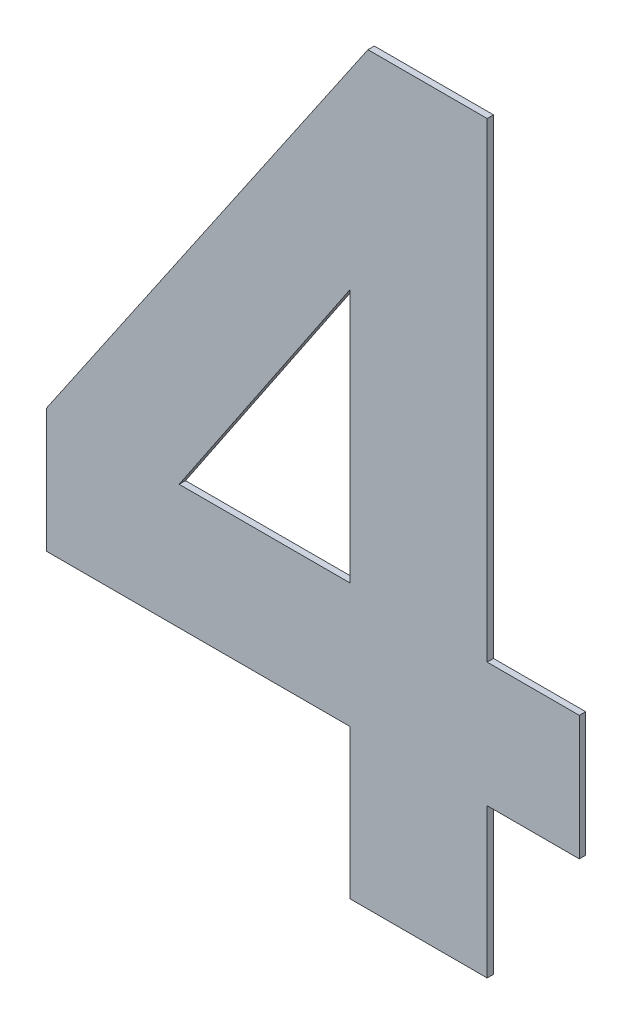
ISO-10303-21;
HEADER;
FILE_DESCRIPTION(('STEP AP214'),'2;1');
FILE_NAME('part.step','',(''),(''),'','','');
FILE_SCHEMA(('AUTOMOTIVE_DESIGN { 1 0 10303 214 1 1 1 1 }'));
ENDSEC;
DATA;
#1=APPLICATION_CONTEXT('core data for automotive mechanical design processes');
#2=APPLICATION_PROTOCOL_DEFINITION('international standard','automotive_design',2000,#1);
#3=PRODUCT_CONTEXT('',#1,'mechanical');
#4=PRODUCT('Part','Part','',(#3));
#5=PRODUCT_RELATED_PRODUCT_CATEGORY('part','',(#4));
#6=PRODUCT_DEFINITION_FORMATION('','',#4);
#7=PRODUCT_DEFINITION_CONTEXT('part definition',#1,'design');
#8=PRODUCT_DEFINITION('design','',#6,#7);
#9=PRODUCT_DEFINITION_SHAPE('','',#8);
#10=(LENGTH_UNIT() NAMED_UNIT(*) SI_UNIT(.MILLI.,.METRE.));
#11=(NAMED_UNIT(*) PLANE_ANGLE_UNIT() SI_UNIT($,.RADIAN.));
#12=(NAMED_UNIT(*) SI_UNIT($,.STERADIAN.) SOLID_ANGLE_UNIT());
#13=UNCERTAINTY_MEASURE_WITH_UNIT(LENGTH_MEASURE(1.E-05),#10,'distance_accuracy_value','');
#14=(GEOMETRIC_REPRESENTATION_CONTEXT(3) GLOBAL_UNCERTAINTY_ASSIGNED_CONTEXT((#13)) GLOBAL_UNIT_ASSIGNED_CONTEXT((#10,
#11,#12)) REPRESENTATION_CONTEXT('',''));
#15=CARTESIAN_POINT('',(0.,0.,0.));
#16=DIRECTION('',(0.,0.,1.));
#17=DIRECTION('',(1.,0.,0.));
#18=AXIS2_PLACEMENT_3D('',#15,#16,#17);
#19=CARTESIAN_POINT('',(-0.0714182155333893,-0.0342638281652913,0.));
#20=DIRECTION('',(0.,-1.,0.));
#21=DIRECTION('',(1.,0.,0.));
#22=AXIS2_PLACEMENT_3D('',#19,#20,#21);
#23=PLANE('',#22);
#24=DIRECTION('',(1.,0.,0.));
#25=VECTOR('',#24,1.);
#26=CARTESIAN_POINT('',(-0.0310230602288788,-0.0342638281652913,0.));
#27=LINE('',#26,#25);
#28=CARTESIAN_POINT('',(-0.0714182155333893,-0.0342638281652913,0.));
#29=VERTEX_POINT('',#28);
#30=CARTESIAN_POINT('',(0.00914580919985388,-0.0342638281652913,0.));
#31=VERTEX_POINT('',#30);
#32=EDGE_CURVE('E11',#29,#31,#27,.T.);
#33=ORIENTED_EDGE('',*,*,#32,.F.);
#34=DIRECTION('',(0.,0.,1.));
#35=VECTOR('',#34,1.);
#36=CARTESIAN_POINT('',(-0.0714182155333893,-0.0342638281652913,0.));
#37=LINE('',#36,#35);
#38=CARTESIAN_POINT('',(-0.0714182155333893,-0.0342638281652913,0.003));
#39=VERTEX_POINT('',#38);
#40=EDGE_CURVE('E24',#29,#39,#37,.T.);
#41=ORIENTED_EDGE('',*,*,#40,.T.);
#42=DIRECTION('',(-1.,0.,0.));
#43=VECTOR('',#42,1.);
#44=CARTESIAN_POINT('',(-0.0310230602288788,-0.0342638281652913,0.003));
#45=LINE('',#44,#43);
#46=CARTESIAN_POINT('',(0.00914580919985388,-0.0342638281652913,0.003));
#47=VERTEX_POINT('',#46);
#48=EDGE_CURVE('E228',#47,#39,#45,.T.);
#49=ORIENTED_EDGE('',*,*,#48,.F.);
#50=DIRECTION('',(0.,0.,1.));
#51=VECTOR('',#50,1.);
#52=CARTESIAN_POINT('',(0.00914580919985388,-0.0342638281652913,0.));
#53=LINE('',#52,#51);
#54=EDGE_CURVE('E225',#31,#47,#53,.T.);
#55=ORIENTED_EDGE('',*,*,#54,.F.);
#56=EDGE_LOOP('',(#33,#41,#49,#55));
#57=FACE_BOUND('',#56,.T.);
#58=ADVANCED_FACE('F17',(#57),#23,.F.);
#59=CARTESIAN_POINT('',(0.00914580919985388,0.0855151357592987,0.));
#60=DIRECTION('',(-0.829768791902232,0.558107294330678,0.));
#61=DIRECTION('',(-0.558107294330678,-0.829768791902232,0.));
#62=AXIS2_PLACEMENT_3D('',#59,#60,#61);
#63=PLANE('',#62);
#64=DIRECTION('',(-0.558107294330678,-0.829768791902233,0.));
#65=VECTOR('',#64,1.);
#66=CARTESIAN_POINT('',(-0.0120148419785438,0.0540544325172438,0.));
#67=LINE('',#66,#65);
#68=CARTESIAN_POINT('',(0.00914580919985388,0.0855151357592987,0.));
#69=VERTEX_POINT('',#68);
#70=EDGE_CURVE('E223',#69,#29,#67,.T.);
#71=ORIENTED_EDGE('',*,*,#70,.F.);
#72=DIRECTION('',(0.,0.,1.));
#73=VECTOR('',#72,1.);
#74=CARTESIAN_POINT('',(0.00914580919985388,0.0855151357592987,0.));
#75=LINE('',#74,#73);
#76=CARTESIAN_POINT('',(0.00914580919985388,0.0855151357592987,0.003));
#77=VERTEX_POINT('',#76);
#78=EDGE_CURVE('E221',#69,#77,#75,.T.);
#79=ORIENTED_EDGE('',*,*,#78,.T.);
#80=DIRECTION('',(0.558107294330678,0.829768791902233,0.));
#81=VECTOR('',#80,1.);
#82=CARTESIAN_POINT('',(-0.0120148419785438,0.0540544325172438,0.003));
#83=LINE('',#82,#81);
#84=EDGE_CURVE('E218',#39,#77,#83,.T.);
#85=ORIENTED_EDGE('',*,*,#84,.F.);
#86=ORIENTED_EDGE('',*,*,#40,.F.);
#87=EDGE_LOOP('',(#71,#79,#85,#86));
#88=FACE_BOUND('',#87,.T.);
#89=ADVANCED_FACE('F233',(#88),#63,.F.);
#90=CARTESIAN_POINT('',(0.00914580919985388,-0.0342638281652913,0.));
#91=DIRECTION('',(1.,0.,0.));
#92=DIRECTION('',(0.,1.,0.));
#93=AXIS2_PLACEMENT_3D('',#90,#91,#92);
#94=PLANE('',#93);
#95=DIRECTION('',(0.,1.,0.));
#96=VECTOR('',#95,1.);
#97=CARTESIAN_POINT('',(0.00914580919985388,-0.0201439265566738,0.));
#98=LINE('',#97,#96);
#99=EDGE_CURVE('E216',#31,#69,#98,.T.);
#100=ORIENTED_EDGE('',*,*,#99,.F.);
#101=ORIENTED_EDGE('',*,*,#54,.T.);
#102=DIRECTION('',(0.,-1.,0.));
#103=VECTOR('',#102,1.);
#104=CARTESIAN_POINT('',(0.00914580919985388,-0.0201439265566738,0.003));
#105=LINE('',#104,#103);
#106=EDGE_CURVE('E213',#77,#47,#105,.T.);
#107=ORIENTED_EDGE('',*,*,#106,.F.);
#108=ORIENTED_EDGE('',*,*,#78,.F.);
#109=EDGE_LOOP('',(#100,#101,#107,#108));
#110=FACE_BOUND('',#109,.T.);
#111=ADVANCED_FACE('F237',(#110),#94,.F.);
#112=CARTESIAN_POINT('',(-0.134108764580781,-0.0929528528054023,0.));
#113=DIRECTION('',(0.,-1.,0.));
#114=DIRECTION('',(1.,0.,0.));
#115=AXIS2_PLACEMENT_3D('',#112,#113,#114);
#116=PLANE('',#115);
#117=DIRECTION('',(-1.,0.,0.));
#118=VECTOR('',#117,1.);
#119=CARTESIAN_POINT('',(0.00914580919985388,-0.0929528528054023,0.));
#120=LINE('',#119,#118);
#121=CARTESIAN_POINT('',(0.00914580919985388,-0.0929528528054023,0.));
#122=VERTEX_POINT('',#121);
#123=CARTESIAN_POINT('',(-0.134108764580781,-0.0929528528054023,0.));
#124=VERTEX_POINT('',#123);
#125=EDGE_CURVE('E211',#122,#124,#120,.T.);
#126=ORIENTED_EDGE('',*,*,#125,.F.);
#127=DIRECTION('',(0.,0.,1.));
#128=VECTOR('',#127,1.);
#129=CARTESIAN_POINT('',(0.00914580919985388,-0.0929528528054023,0.));
#130=LINE('',#129,#128);
#131=CARTESIAN_POINT('',(0.00914580919985388,-0.0929528528054023,0.003));
#132=VERTEX_POINT('',#131);
#133=EDGE_CURVE('E209',#122,#132,#130,.T.);
#134=ORIENTED_EDGE('',*,*,#133,.T.);
#135=DIRECTION('',(1.,0.,0.));
#136=VECTOR('',#135,1.);
#137=CARTESIAN_POINT('',(0.00914580919985388,-0.0929528528054023,0.003));
#138=LINE('',#137,#136);
#139=CARTESIAN_POINT('',(-0.134108764580781,-0.0929528528054023,0.003));
#140=VERTEX_POINT('',#139);
#141=EDGE_CURVE('E140',#140,#132,#138,.T.);
#142=ORIENTED_EDGE('',*,*,#141,.F.);
#143=DIRECTION('',(0.,0.,1.));
#144=VECTOR('',#143,1.);
#145=CARTESIAN_POINT('',(-0.134108764580781,-0.0929528528054023,0.));
#146=LINE('',#145,#144);
#147=EDGE_CURVE('E205',#124,#140,#146,.T.);
#148=ORIENTED_EDGE('',*,*,#147,.F.);
#149=EDGE_LOOP('',(#126,#134,#142,#148));
#150=FACE_BOUND('',#149,.T.);
#151=ADVANCED_FACE('F256',(#150),#116,.T.);
#152=CARTESIAN_POINT('',(-0.134108764580781,-0.03453059645911,0.));
#153=DIRECTION('',(-1.,0.,0.));
#154=DIRECTION('',(0.,-1.,0.));
#155=AXIS2_PLACEMENT_3D('',#152,#153,#154);
#156=PLANE('',#155);
#157=DIRECTION('',(0.,1.,0.));
#158=VECTOR('',#157,1.);
#159=CARTESIAN_POINT('',(-0.134108764580781,-0.0929528528054023,0.));
#160=LINE('',#159,#158);
#161=CARTESIAN_POINT('',(-0.134108764580781,-0.03453059645911,0.));
#162=VERTEX_POINT('',#161);
#163=EDGE_CURVE('E203',#124,#162,#160,.T.);
#164=ORIENTED_EDGE('',*,*,#163,.F.);
#165=ORIENTED_EDGE('',*,*,#147,.T.);
#166=DIRECTION('',(0.,-1.,0.));
#167=VECTOR('',#166,1.);
#168=CARTESIAN_POINT('',(-0.134108764580781,-0.0929528528054023,0.003));
#169=LINE('',#168,#167);
#170=CARTESIAN_POINT('',(-0.134108764580781,-0.03453059645911,0.003));
#171=VERTEX_POINT('',#170);
#172=EDGE_CURVE('E201',#171,#140,#169,.T.);
#173=ORIENTED_EDGE('',*,*,#172,.F.);
#174=DIRECTION('',(0.,0.,1.));
#175=VECTOR('',#174,1.);
#176=CARTESIAN_POINT('',(-0.134108764580781,-0.03453059645911,0.));
#177=LINE('',#176,#175);
#178=EDGE_CURVE('E198',#162,#171,#177,.T.);
#179=ORIENTED_EDGE('',*,*,#178,.F.);
#180=EDGE_LOOP('',(#164,#165,#173,#179));
#181=FACE_BOUND('',#180,.T.);
#182=ADVANCED_FACE('F261',(#181),#156,.T.);
#183=CARTESIAN_POINT('',(0.0176823946020518,0.187954160585674,0.));
#184=DIRECTION('',(-0.826059665171431,0.563582673240461,0.));
#185=DIRECTION('',(-0.563582673240461,-0.826059665171431,0.));
#186=AXIS2_PLACEMENT_3D('',#183,#184,#185);
#187=PLANE('',#186);
#188=DIRECTION('',(0.56358267324046,0.826059665171431,0.));
#189=VECTOR('',#188,1.);
#190=CARTESIAN_POINT('',(-0.134108764580781,-0.03453059645911,0.));
#191=LINE('',#190,#189);
#192=CARTESIAN_POINT('',(0.0176823946020518,0.187954160585674,0.));
#193=VERTEX_POINT('',#192);
#194=EDGE_CURVE('E196',#162,#193,#191,.T.);
#195=ORIENTED_EDGE('',*,*,#194,.F.);
#196=ORIENTED_EDGE('',*,*,#178,.T.);
#197=DIRECTION('',(-0.56358267324046,-0.826059665171431,0.));
#198=VECTOR('',#197,1.);
#199=CARTESIAN_POINT('',(-0.134108764580781,-0.03453059645911,0.003));
#200=LINE('',#199,#198);
#201=CARTESIAN_POINT('',(0.0176823946020518,0.187954160585674,0.003));
#202=VERTEX_POINT('',#201);
#203=EDGE_CURVE('E193',#202,#171,#200,.T.);
#204=ORIENTED_EDGE('',*,*,#203,.F.);
#205=DIRECTION('',(0.,0.,1.));
#206=VECTOR('',#205,1.);
#207=CARTESIAN_POINT('',(0.0176823946020518,0.187954160585674,0.));
#208=LINE('',#207,#206);
#209=EDGE_CURVE('E190',#193,#202,#208,.T.);
#210=ORIENTED_EDGE('',*,*,#209,.F.);
#211=EDGE_LOOP('',(#195,#196,#204,#210));
#212=FACE_BOUND('',#211,.T.);
#213=ADVANCED_FACE('F265',(#212),#187,.T.);
#214=CARTESIAN_POINT('',(0.0739705045977946,0.187954160585674,0.));
#215=DIRECTION('',(0.,1.,0.));
#216=DIRECTION('',(-1.,0.,0.));
#217=AXIS2_PLACEMENT_3D('',#214,#215,#216);
#218=PLANE('',#217);
#219=DIRECTION('',(1.,0.,0.));
#220=VECTOR('',#219,1.);
#221=CARTESIAN_POINT('',(0.0176823946020518,0.187954160585674,0.));
#222=LINE('',#221,#220);
#223=CARTESIAN_POINT('',(0.0739705045977946,0.187954160585674,0.));
#224=VERTEX_POINT('',#223);
#225=EDGE_CURVE('E188',#193,#224,#222,.T.);
#226=ORIENTED_EDGE('',*,*,#225,.F.);
#227=ORIENTED_EDGE('',*,*,#209,.T.);
#228=DIRECTION('',(-1.,0.,0.));
#229=VECTOR('',#228,1.);
#230=CARTESIAN_POINT('',(0.0176823946020518,0.187954160585674,0.003));
#231=LINE('',#230,#229);
#232=CARTESIAN_POINT('',(0.0739705045977946,0.187954160585674,0.003));
#233=VERTEX_POINT('',#232);
#234=EDGE_CURVE('E185',#233,#202,#231,.T.);
#235=ORIENTED_EDGE('',*,*,#234,.F.);
#236=DIRECTION('',(0.,0.,1.));
#237=VECTOR('',#236,1.);
#238=CARTESIAN_POINT('',(0.0739705045977946,0.187954160585674,0.));
#239=LINE('',#238,#237);
#240=EDGE_CURVE('E182',#224,#233,#239,.T.);
#241=ORIENTED_EDGE('',*,*,#240,.F.);
#242=EDGE_LOOP('',(#226,#227,#235,#241));
#243=FACE_BOUND('',#242,.T.);
#244=ADVANCED_FACE('F269',(#243),#218,.T.);
#245=CARTESIAN_POINT('',(0.0739705045977946,-0.0342638281652913,0.));
#246=DIRECTION('',(1.,0.,0.));
#247=DIRECTION('',(0.,1.,0.));
#248=AXIS2_PLACEMENT_3D('',#245,#246,#247);
#249=PLANE('',#248);
#250=DIRECTION('',(0.,-1.,0.));
#251=VECTOR('',#250,1.);
#252=CARTESIAN_POINT('',(0.0739705045977946,0.187954160585674,0.));
#253=LINE('',#252,#251);
#254=CARTESIAN_POINT('',(0.0739705045977946,-0.0342638281652913,0.));
#255=VERTEX_POINT('',#254);
#256=EDGE_CURVE('E180',#224,#255,#253,.T.);
#257=ORIENTED_EDGE('',*,*,#256,.F.);
#258=ORIENTED_EDGE('',*,*,#240,.T.);
#259=DIRECTION('',(0.,1.,0.));
#260=VECTOR('',#259,1.);
#261=CARTESIAN_POINT('',(0.0739705045977946,0.187954160585674,0.003));
#262=LINE('',#261,#260);
#263=CARTESIAN_POINT('',(0.0739705045977946,-0.0342638281652913,0.003));
#264=VERTEX_POINT('',#263);
#265=EDGE_CURVE('E177',#264,#233,#262,.T.);
#266=ORIENTED_EDGE('',*,*,#265,.F.);
#267=DIRECTION('',(0.,0.,1.));
#268=VECTOR('',#267,1.);
#269=CARTESIAN_POINT('',(0.0739705045977946,-0.0342638281652913,0.));
#270=LINE('',#269,#268);
#271=EDGE_CURVE('E174',#255,#264,#270,.T.);
#272=ORIENTED_EDGE('',*,*,#271,.F.);
#273=EDGE_LOOP('',(#257,#258,#266,#272));
#274=FACE_BOUND('',#273,.T.);
#275=ADVANCED_FACE('F273',(#274),#249,.T.);
#276=CARTESIAN_POINT('',(0.11745373649024,-0.0342638281652913,0.));
#277=DIRECTION('',(0.,1.,0.));
#278=DIRECTION('',(-1.,0.,0.));
#279=AXIS2_PLACEMENT_3D('',#276,#277,#278);
#280=PLANE('',#279);
#281=DIRECTION('',(1.,0.,0.));
#282=VECTOR('',#281,1.);
#283=CARTESIAN_POINT('',(0.0739705045977946,-0.0342638281652913,0.));
#284=LINE('',#283,#282);
#285=CARTESIAN_POINT('',(0.11745373649024,-0.0342638281652913,0.));
#286=VERTEX_POINT('',#285);
#287=EDGE_CURVE('E172',#255,#286,#284,.T.);
#288=ORIENTED_EDGE('',*,*,#287,.F.);
#289=ORIENTED_EDGE('',*,*,#271,.T.);
#290=DIRECTION('',(-1.,0.,0.));
#291=VECTOR('',#290,1.);
#292=CARTESIAN_POINT('',(0.0739705045977946,-0.0342638281652913,0.003));
#293=LINE('',#292,#291);
#294=CARTESIAN_POINT('',(0.11745373649024,-0.0342638281652913,0.003));
#295=VERTEX_POINT('',#294);
#296=EDGE_CURVE('E169',#295,#264,#293,.T.);
#297=ORIENTED_EDGE('',*,*,#296,.F.);
#298=DIRECTION('',(0.,0.,1.));
#299=VECTOR('',#298,1.);
#300=CARTESIAN_POINT('',(0.11745373649024,-0.0342638281652913,0.));
#301=LINE('',#300,#299);
#302=EDGE_CURVE('E166',#286,#295,#301,.T.);
#303=ORIENTED_EDGE('',*,*,#302,.F.);
#304=EDGE_LOOP('',(#288,#289,#297,#303));
#305=FACE_BOUND('',#304,.T.);
#306=ADVANCED_FACE('F277',(#305),#280,.T.);
#307=CARTESIAN_POINT('',(0.11745373649024,-0.0929528528054023,0.));
#308=DIRECTION('',(1.,0.,0.));
#309=DIRECTION('',(0.,1.,0.));
#310=AXIS2_PLACEMENT_3D('',#307,#308,#309);
#311=PLANE('',#310);
#312=DIRECTION('',(0.,-1.,0.));
#313=VECTOR('',#312,1.);
#314=CARTESIAN_POINT('',(0.11745373649024,-0.0342638281652913,0.));
#315=LINE('',#314,#313);
#316=CARTESIAN_POINT('',(0.11745373649024,-0.0929528528054023,0.));
#317=VERTEX_POINT('',#316);
#318=EDGE_CURVE('E164',#286,#317,#315,.T.);
#319=ORIENTED_EDGE('',*,*,#318,.F.);
#320=ORIENTED_EDGE('',*,*,#302,.T.);
#321=DIRECTION('',(0.,1.,0.));
#322=VECTOR('',#321,1.);
#323=CARTESIAN_POINT('',(0.11745373649024,-0.0342638281652913,0.003));
#324=LINE('',#323,#322);
#325=CARTESIAN_POINT('',(0.11745373649024,-0.0929528528054023,0.003));
#326=VERTEX_POINT('',#325);
#327=EDGE_CURVE('E161',#326,#295,#324,.T.);
#328=ORIENTED_EDGE('',*,*,#327,.F.);
#329=DIRECTION('',(0.,0.,1.));
#330=VECTOR('',#329,1.);
#331=CARTESIAN_POINT('',(0.11745373649024,-0.0929528528054023,0.));
#332=LINE('',#331,#330);
#333=EDGE_CURVE('E158',#317,#326,#332,.T.);
#334=ORIENTED_EDGE('',*,*,#333,.F.);
#335=EDGE_LOOP('',(#319,#320,#328,#334));
#336=FACE_BOUND('',#335,.T.);
#337=ADVANCED_FACE('F281',(#336),#311,.T.);
#338=CARTESIAN_POINT('',(0.0739705045977946,-0.0929528528054023,0.));
#339=DIRECTION('',(0.,-1.,0.));
#340=DIRECTION('',(1.,0.,0.));
#341=AXIS2_PLACEMENT_3D('',#338,#339,#340);
#342=PLANE('',#341);
#343=DIRECTION('',(-1.,0.,0.));
#344=VECTOR('',#343,1.);
#345=CARTESIAN_POINT('',(0.11745373649024,-0.0929528528054023,0.));
#346=LINE('',#345,#344);
#347=CARTESIAN_POINT('',(0.0739705045977946,-0.0929528528054023,0.));
#348=VERTEX_POINT('',#347);
#349=EDGE_CURVE('E156',#317,#348,#346,.T.);
#350=ORIENTED_EDGE('',*,*,#349,.F.);
#351=ORIENTED_EDGE('',*,*,#333,.T.);
#352=DIRECTION('',(1.,0.,0.));
#353=VECTOR('',#352,1.);
#354=CARTESIAN_POINT('',(0.11745373649024,-0.0929528528054023,0.003));
#355=LINE('',#354,#353);
#356=CARTESIAN_POINT('',(0.0739705045977946,-0.0929528528054023,0.003));
#357=VERTEX_POINT('',#356);
#358=EDGE_CURVE('E153',#357,#326,#355,.T.);
#359=ORIENTED_EDGE('',*,*,#358,.F.);
#360=DIRECTION('',(0.,0.,1.));
#361=VECTOR('',#360,1.);
#362=CARTESIAN_POINT('',(0.0739705045977946,-0.0929528528054023,0.));
#363=LINE('',#362,#361);
#364=EDGE_CURVE('E150',#348,#357,#363,.T.);
#365=ORIENTED_EDGE('',*,*,#364,.F.);
#366=EDGE_LOOP('',(#350,#351,#359,#365));
#367=FACE_BOUND('',#366,.T.);
#368=ADVANCED_FACE('F285',(#367),#342,.T.);
#369=CARTESIAN_POINT('',(0.0739705045977946,-0.163379682373535,0.));
#370=DIRECTION('',(1.,0.,0.));
#371=DIRECTION('',(0.,1.,0.));
#372=AXIS2_PLACEMENT_3D('',#369,#370,#371);
#373=PLANE('',#372);
#374=DIRECTION('',(0.,-1.,0.));
#375=VECTOR('',#374,1.);
#376=CARTESIAN_POINT('',(0.0739705045977946,-0.0929528528054023,0.));
#377=LINE('',#376,#375);
#378=CARTESIAN_POINT('',(0.0739705045977946,-0.163379682373535,0.));
#379=VERTEX_POINT('',#378);
#380=EDGE_CURVE('E148',#348,#379,#377,.T.);
#381=ORIENTED_EDGE('',*,*,#380,.F.);
#382=ORIENTED_EDGE('',*,*,#364,.T.);
#383=DIRECTION('',(0.,1.,0.));
#384=VECTOR('',#383,1.);
#385=CARTESIAN_POINT('',(0.0739705045977946,-0.0929528528054023,0.003));
#386=LINE('',#385,#384);
#387=CARTESIAN_POINT('',(0.0739705045977946,-0.163379682373535,0.003));
#388=VERTEX_POINT('',#387);
#389=EDGE_CURVE('E146',#388,#357,#386,.T.);
#390=ORIENTED_EDGE('',*,*,#389,.F.);
#391=DIRECTION('',(0.,0.,1.));
#392=VECTOR('',#391,1.);
#393=CARTESIAN_POINT('',(0.0739705045977946,-0.163379682373535,0.));
#394=LINE('',#393,#392);
#395=EDGE_CURVE('E122',#379,#388,#394,.T.);
#396=ORIENTED_EDGE('',*,*,#395,.F.);
#397=EDGE_LOOP('',(#381,#382,#390,#396));
#398=FACE_BOUND('',#397,.T.);
#399=ADVANCED_FACE('F289',(#398),#373,.T.);
#400=CARTESIAN_POINT('',(0.00914580919985388,-0.163379682373535,0.));
#401=DIRECTION('',(0.,-1.,0.));
#402=DIRECTION('',(1.,0.,0.));
#403=AXIS2_PLACEMENT_3D('',#400,#401,#402);
#404=PLANE('',#403);
#405=DIRECTION('',(-1.,0.,0.));
#406=VECTOR('',#405,1.);
#407=CARTESIAN_POINT('',(0.0739705045977946,-0.163379682373535,0.));
#408=LINE('',#407,#406);
#409=CARTESIAN_POINT('',(0.00914580919985388,-0.163379682373535,0.));
#410=VERTEX_POINT('',#409);
#411=EDGE_CURVE('E126',#379,#410,#408,.T.);
#412=ORIENTED_EDGE('',*,*,#411,.F.);
#413=ORIENTED_EDGE('',*,*,#395,.T.);
#414=DIRECTION('',(1.,0.,0.));
#415=VECTOR('',#414,1.);
#416=CARTESIAN_POINT('',(0.0739705045977946,-0.163379682373535,0.003));
#417=LINE('',#416,#415);
#418=CARTESIAN_POINT('',(0.00914580919985388,-0.163379682373535,0.003));
#419=VERTEX_POINT('',#418);
#420=EDGE_CURVE('E115',#419,#388,#417,.T.);
#421=ORIENTED_EDGE('',*,*,#420,.F.);
#422=DIRECTION('',(0.,0.,1.));
#423=VECTOR('',#422,1.);
#424=CARTESIAN_POINT('',(0.00914580919985388,-0.163379682373535,0.));
#425=LINE('',#424,#423);
#426=EDGE_CURVE('E119',#410,#419,#425,.T.);
#427=ORIENTED_EDGE('',*,*,#426,.F.);
#428=EDGE_LOOP('',(#412,#413,#421,#427));
#429=FACE_BOUND('',#428,.T.);
#430=ADVANCED_FACE('F118',(#429),#404,.T.);
#431=CARTESIAN_POINT('',(0.00914580919985388,-0.0929528528054023,0.));
#432=DIRECTION('',(-1.,0.,0.));
#433=DIRECTION('',(0.,-1.,0.));
#434=AXIS2_PLACEMENT_3D('',#431,#432,#433);
#435=PLANE('',#434);
#436=DIRECTION('',(0.,1.,0.));
#437=VECTOR('',#436,1.);
#438=CARTESIAN_POINT('',(0.00914580919985388,-0.163379682373535,0.));
#439=LINE('',#438,#437);
#440=EDGE_CURVE('E134',#410,#122,#439,.T.);
#441=ORIENTED_EDGE('',*,*,#440,.F.);
#442=ORIENTED_EDGE('',*,*,#426,.T.);
#443=DIRECTION('',(0.,-1.,0.));
#444=VECTOR('',#443,1.);
#445=CARTESIAN_POINT('',(0.00914580919985388,-0.163379682373535,0.003));
#446=LINE('',#445,#444);
#447=EDGE_CURVE('E132',#132,#419,#446,.T.);
#448=ORIENTED_EDGE('',*,*,#447,.F.);
#449=ORIENTED_EDGE('',*,*,#133,.F.);
#450=EDGE_LOOP('',(#441,#442,#448,#449));
#451=FACE_BOUND('',#450,.T.);
#452=ADVANCED_FACE('F130',(#451),#435,.T.);
#453=CARTESIAN_POINT('',(0.00937209507563164,-0.00602402494805632,0.));
#454=DIRECTION('',(0.,0.,1.));
#455=DIRECTION('',(1.,0.,0.));
#456=AXIS2_PLACEMENT_3D('',#453,#454,#455);
#457=PLANE('',#456);
#458=ORIENTED_EDGE('',*,*,#440,.T.);
#459=ORIENTED_EDGE('',*,*,#125,.T.);
#460=ORIENTED_EDGE('',*,*,#163,.T.);
#461=ORIENTED_EDGE('',*,*,#194,.T.);
#462=ORIENTED_EDGE('',*,*,#225,.T.);
#463=ORIENTED_EDGE('',*,*,#256,.T.);
#464=ORIENTED_EDGE('',*,*,#287,.T.);
#465=ORIENTED_EDGE('',*,*,#318,.T.);
#466=ORIENTED_EDGE('',*,*,#349,.T.);
#467=ORIENTED_EDGE('',*,*,#380,.T.);
#468=ORIENTED_EDGE('',*,*,#411,.T.);
#469=EDGE_LOOP('',(#458,#459,#460,#461,#462,#463,#464,#465,#466,#467,#468));
#470=FACE_BOUND('',#469,.T.);
#471=ORIENTED_EDGE('',*,*,#32,.T.);
#472=ORIENTED_EDGE('',*,*,#99,.T.);
#473=ORIENTED_EDGE('',*,*,#70,.T.);
#474=EDGE_LOOP('',(#471,#472,#473));
#475=FACE_BOUND('',#474,.T.);
#476=ADVANCED_FACE('F238',(#470,#475),#457,.F.);
#477=CARTESIAN_POINT('',(0.00937209507563164,-0.00602402494805632,0.003));
#478=DIRECTION('',(0.,0.,1.));
#479=DIRECTION('',(1.,0.,0.));
#480=AXIS2_PLACEMENT_3D('',#477,#478,#479);
#481=PLANE('',#480);
#482=ORIENTED_EDGE('',*,*,#447,.T.);
#483=ORIENTED_EDGE('',*,*,#420,.T.);
#484=ORIENTED_EDGE('',*,*,#389,.T.);
#485=ORIENTED_EDGE('',*,*,#358,.T.);
#486=ORIENTED_EDGE('',*,*,#327,.T.);
#487=ORIENTED_EDGE('',*,*,#296,.T.);
#488=ORIENTED_EDGE('',*,*,#265,.T.);
#489=ORIENTED_EDGE('',*,*,#234,.T.);
#490=ORIENTED_EDGE('',*,*,#203,.T.);
#491=ORIENTED_EDGE('',*,*,#172,.T.);
#492=ORIENTED_EDGE('',*,*,#141,.T.);
#493=EDGE_LOOP('',(#482,#483,#484,#485,#486,#487,#488,#489,#490,#491,#492));
#494=FACE_BOUND('',#493,.T.);
#495=ORIENTED_EDGE('',*,*,#48,.T.);
#496=ORIENTED_EDGE('',*,*,#84,.T.);
#497=ORIENTED_EDGE('',*,*,#106,.T.);
#498=EDGE_LOOP('',(#495,#496,#497));
#499=FACE_BOUND('',#498,.T.);
#500=ADVANCED_FACE('F137',(#494,#499),#481,.T.);
#501=CLOSED_SHELL('',(#58,#89,#111,#151,#182,#213,#244,#275,#306,#337,#368,#399,#430,#452,#476,#500));
#502=MANIFOLD_SOLID_BREP('B1',#501);
#503=ADVANCED_BREP_SHAPE_REPRESENTATION('',(#18,#502),#14);
#504=SHAPE_DEFINITION_REPRESENTATION(#9,#503);
ENDSEC;
END-ISO-10303-21;
